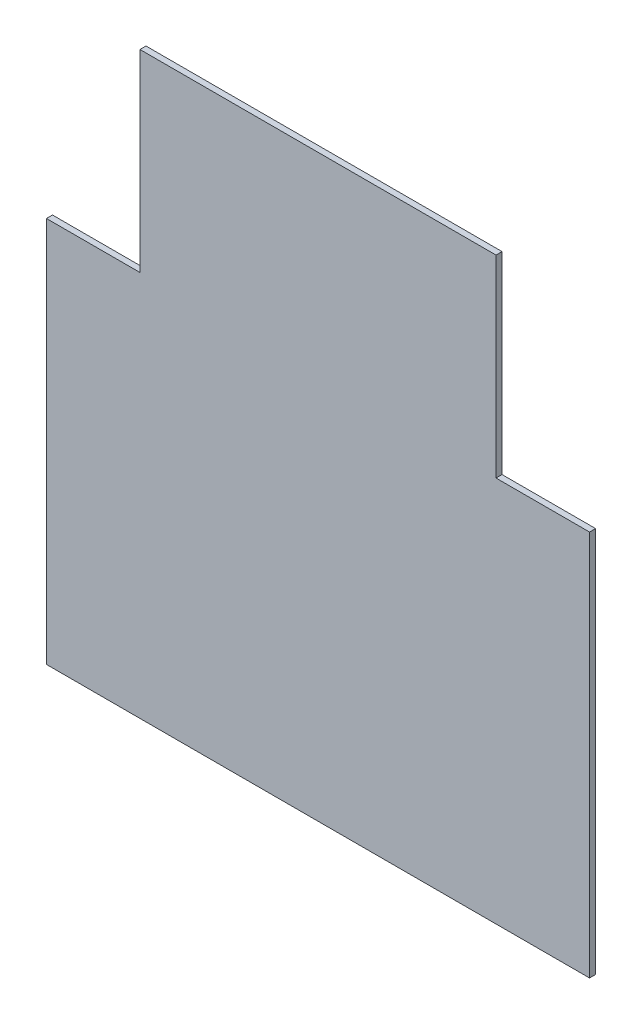
ISO-10303-21;
HEADER;
FILE_DESCRIPTION(('STEP AP214'),'2;1');
FILE_NAME('part.step','',(''),(''),'','','');
FILE_SCHEMA(('AUTOMOTIVE_DESIGN { 1 0 10303 214 1 1 1 1 }'));
ENDSEC;
DATA;
#1=APPLICATION_CONTEXT('core data for automotive mechanical design processes');
#2=APPLICATION_PROTOCOL_DEFINITION('international standard','automotive_design',2000,#1);
#3=PRODUCT_CONTEXT('',#1,'mechanical');
#4=PRODUCT('Part','Part','',(#3));
#5=PRODUCT_RELATED_PRODUCT_CATEGORY('part','',(#4));
#6=PRODUCT_DEFINITION_FORMATION('','',#4);
#7=PRODUCT_DEFINITION_CONTEXT('part definition',#1,'design');
#8=PRODUCT_DEFINITION('design','',#6,#7);
#9=PRODUCT_DEFINITION_SHAPE('','',#8);
#10=(LENGTH_UNIT() NAMED_UNIT(*) SI_UNIT(.MILLI.,.METRE.));
#11=(NAMED_UNIT(*) PLANE_ANGLE_UNIT() SI_UNIT($,.RADIAN.));
#12=(NAMED_UNIT(*) SI_UNIT($,.STERADIAN.) SOLID_ANGLE_UNIT());
#13=UNCERTAINTY_MEASURE_WITH_UNIT(LENGTH_MEASURE(1.E-05),#10,'distance_accuracy_value','');
#14=(GEOMETRIC_REPRESENTATION_CONTEXT(3) GLOBAL_UNCERTAINTY_ASSIGNED_CONTEXT((#13)) GLOBAL_UNIT_ASSIGNED_CONTEXT((#10,
#11,#12)) REPRESENTATION_CONTEXT('',''));
#15=CARTESIAN_POINT('',(0.,0.,0.));
#16=DIRECTION('',(0.,0.,1.));
#17=DIRECTION('',(1.,0.,0.));
#18=AXIS2_PLACEMENT_3D('',#15,#16,#17);
#19=CARTESIAN_POINT('',(142.875,101.6,3.175));
#20=DIRECTION('',(-1.,0.,0.));
#21=DIRECTION('',(0.,0.,1.));
#22=AXIS2_PLACEMENT_3D('',#19,#20,#21);
#23=PLANE('',#22);
#24=DIRECTION('',(0.,1.,0.));
#25=VECTOR('',#24,1.);
#26=CARTESIAN_POINT('',(142.875,101.6,0.));
#27=LINE('',#26,#25);
#28=CARTESIAN_POINT('',(142.875,-101.6,0.));
#29=VERTEX_POINT('',#28);
#30=CARTESIAN_POINT('',(142.875,101.6,0.));
#31=VERTEX_POINT('',#30);
#32=EDGE_CURVE('E144',#29,#31,#27,.T.);
#33=ORIENTED_EDGE('',*,*,#32,.T.);
#34=DIRECTION('',(0.,0.,-1.));
#35=VECTOR('',#34,1.);
#36=CARTESIAN_POINT('',(142.875,101.6,3.175));
#37=LINE('',#36,#35);
#38=CARTESIAN_POINT('',(142.875,101.6,3.175));
#39=VERTEX_POINT('',#38);
#40=EDGE_CURVE('E11',#39,#31,#37,.T.);
#41=ORIENTED_EDGE('',*,*,#40,.F.);
#42=DIRECTION('',(0.,1.,0.));
#43=VECTOR('',#42,1.);
#44=CARTESIAN_POINT('',(142.875,101.6,3.175));
#45=LINE('',#44,#43);
#46=CARTESIAN_POINT('',(142.875,-101.6,3.175));
#47=VERTEX_POINT('',#46);
#48=EDGE_CURVE('E166',#47,#39,#45,.T.);
#49=ORIENTED_EDGE('',*,*,#48,.F.);
#50=DIRECTION('',(0.,0.,-1.));
#51=VECTOR('',#50,1.);
#52=CARTESIAN_POINT('',(142.875,-101.6,3.175));
#53=LINE('',#52,#51);
#54=EDGE_CURVE('E140',#47,#29,#53,.T.);
#55=ORIENTED_EDGE('',*,*,#54,.T.);
#56=EDGE_LOOP('',(#33,#41,#49,#55));
#57=FACE_BOUND('',#56,.T.);
#58=ADVANCED_FACE('F43',(#57),#23,.F.);
#59=CARTESIAN_POINT('',(93.6625,101.6,3.175));
#60=DIRECTION('',(0.,-1.,0.));
#61=DIRECTION('',(0.,0.,-1.));
#62=AXIS2_PLACEMENT_3D('',#59,#60,#61);
#63=PLANE('',#62);
#64=DIRECTION('',(-1.,0.,0.));
#65=VECTOR('',#64,1.);
#66=CARTESIAN_POINT('',(93.6625,101.6,0.));
#67=LINE('',#66,#65);
#68=CARTESIAN_POINT('',(93.6625,101.6,0.));
#69=VERTEX_POINT('',#68);
#70=EDGE_CURVE('E148',#31,#69,#67,.T.);
#71=ORIENTED_EDGE('',*,*,#70,.T.);
#72=DIRECTION('',(0.,0.,-1.));
#73=VECTOR('',#72,1.);
#74=CARTESIAN_POINT('',(93.6625,101.6,3.175));
#75=LINE('',#74,#73);
#76=CARTESIAN_POINT('',(93.6625,101.6,3.175));
#77=VERTEX_POINT('',#76);
#78=EDGE_CURVE('E52',#77,#69,#75,.T.);
#79=ORIENTED_EDGE('',*,*,#78,.F.);
#80=DIRECTION('',(-1.,0.,0.));
#81=VECTOR('',#80,1.);
#82=CARTESIAN_POINT('',(93.6625,101.6,3.175));
#83=LINE('',#82,#81);
#84=EDGE_CURVE('E103',#39,#77,#83,.T.);
#85=ORIENTED_EDGE('',*,*,#84,.F.);
#86=ORIENTED_EDGE('',*,*,#40,.T.);
#87=EDGE_LOOP('',(#71,#79,#85,#86));
#88=FACE_BOUND('',#87,.T.);
#89=ADVANCED_FACE('F212',(#88),#63,.F.);
#90=CARTESIAN_POINT('',(93.6625,203.2,3.175));
#91=DIRECTION('',(-1.,0.,0.));
#92=DIRECTION('',(0.,-1.,0.));
#93=AXIS2_PLACEMENT_3D('',#90,#91,#92);
#94=PLANE('',#93);
#95=DIRECTION('',(0.,1.,0.));
#96=VECTOR('',#95,1.);
#97=CARTESIAN_POINT('',(93.6625,203.2,0.));
#98=LINE('',#97,#96);
#99=CARTESIAN_POINT('',(93.6625,203.2,0.));
#100=VERTEX_POINT('',#99);
#101=EDGE_CURVE('E151',#69,#100,#98,.T.);
#102=ORIENTED_EDGE('',*,*,#101,.T.);
#103=DIRECTION('',(0.,0.,-1.));
#104=VECTOR('',#103,1.);
#105=CARTESIAN_POINT('',(93.6625,203.2,3.175));
#106=LINE('',#105,#104);
#107=CARTESIAN_POINT('',(93.6625,203.2,3.175));
#108=VERTEX_POINT('',#107);
#109=EDGE_CURVE('E177',#108,#100,#106,.T.);
#110=ORIENTED_EDGE('',*,*,#109,.F.);
#111=DIRECTION('',(0.,1.,0.));
#112=VECTOR('',#111,1.);
#113=CARTESIAN_POINT('',(93.6625,203.2,3.175));
#114=LINE('',#113,#112);
#115=EDGE_CURVE('E187',#77,#108,#114,.T.);
#116=ORIENTED_EDGE('',*,*,#115,.F.);
#117=ORIENTED_EDGE('',*,*,#78,.T.);
#118=EDGE_LOOP('',(#102,#110,#116,#117));
#119=FACE_BOUND('',#118,.T.);
#120=ADVANCED_FACE('F185',(#119),#94,.F.);
#121=CARTESIAN_POINT('',(-93.6625,203.2,3.175));
#122=DIRECTION('',(0.,-1.,0.));
#123=DIRECTION('',(0.,0.,-1.));
#124=AXIS2_PLACEMENT_3D('',#121,#122,#123);
#125=PLANE('',#124);
#126=DIRECTION('',(-1.,0.,0.));
#127=VECTOR('',#126,1.);
#128=CARTESIAN_POINT('',(-93.6625,203.2,0.));
#129=LINE('',#128,#127);
#130=CARTESIAN_POINT('',(-93.6625,203.2,0.));
#131=VERTEX_POINT('',#130);
#132=EDGE_CURVE('E154',#100,#131,#129,.T.);
#133=ORIENTED_EDGE('',*,*,#132,.T.);
#134=DIRECTION('',(0.,0.,-1.));
#135=VECTOR('',#134,1.);
#136=CARTESIAN_POINT('',(-93.6625,203.2,3.175));
#137=LINE('',#136,#135);
#138=CARTESIAN_POINT('',(-93.6625,203.2,3.175));
#139=VERTEX_POINT('',#138);
#140=EDGE_CURVE('E173',#139,#131,#137,.T.);
#141=ORIENTED_EDGE('',*,*,#140,.F.);
#142=DIRECTION('',(-1.,0.,0.));
#143=VECTOR('',#142,1.);
#144=CARTESIAN_POINT('',(-93.6625,203.2,3.175));
#145=LINE('',#144,#143);
#146=EDGE_CURVE('E200',#108,#139,#145,.T.);
#147=ORIENTED_EDGE('',*,*,#146,.F.);
#148=ORIENTED_EDGE('',*,*,#109,.T.);
#149=EDGE_LOOP('',(#133,#141,#147,#148));
#150=FACE_BOUND('',#149,.T.);
#151=ADVANCED_FACE('F195',(#150),#125,.F.);
#152=CARTESIAN_POINT('',(-93.6625,203.2,3.175));
#153=DIRECTION('',(1.,0.,0.));
#154=DIRECTION('',(0.,0.,-1.));
#155=AXIS2_PLACEMENT_3D('',#152,#153,#154);
#156=PLANE('',#155);
#157=DIRECTION('',(0.,-1.,0.));
#158=VECTOR('',#157,1.);
#159=CARTESIAN_POINT('',(-93.6625,203.2,0.));
#160=LINE('',#159,#158);
#161=CARTESIAN_POINT('',(-93.6625,101.6,0.));
#162=VERTEX_POINT('',#161);
#163=EDGE_CURVE('E157',#131,#162,#160,.T.);
#164=ORIENTED_EDGE('',*,*,#163,.T.);
#165=DIRECTION('',(0.,0.,-1.));
#166=VECTOR('',#165,1.);
#167=CARTESIAN_POINT('',(-93.6625,101.6,3.175));
#168=LINE('',#167,#166);
#169=CARTESIAN_POINT('',(-93.6625,101.6,3.175));
#170=VERTEX_POINT('',#169);
#171=EDGE_CURVE('E133',#170,#162,#168,.T.);
#172=ORIENTED_EDGE('',*,*,#171,.F.);
#173=DIRECTION('',(0.,-1.,0.));
#174=VECTOR('',#173,1.);
#175=CARTESIAN_POINT('',(-93.6625,203.2,3.175));
#176=LINE('',#175,#174);
#177=EDGE_CURVE('E122',#139,#170,#176,.T.);
#178=ORIENTED_EDGE('',*,*,#177,.F.);
#179=ORIENTED_EDGE('',*,*,#140,.T.);
#180=EDGE_LOOP('',(#164,#172,#178,#179));
#181=FACE_BOUND('',#180,.T.);
#182=ADVANCED_FACE('F198',(#181),#156,.F.);
#183=CARTESIAN_POINT('',(-142.875,101.6,3.175));
#184=DIRECTION('',(0.,-1.,0.));
#185=DIRECTION('',(0.,0.,-1.));
#186=AXIS2_PLACEMENT_3D('',#183,#184,#185);
#187=PLANE('',#186);
#188=DIRECTION('',(-1.,0.,0.));
#189=VECTOR('',#188,1.);
#190=CARTESIAN_POINT('',(-142.875,101.6,0.));
#191=LINE('',#190,#189);
#192=CARTESIAN_POINT('',(-142.875,101.6,0.));
#193=VERTEX_POINT('',#192);
#194=EDGE_CURVE('E131',#162,#193,#191,.T.);
#195=ORIENTED_EDGE('',*,*,#194,.T.);
#196=DIRECTION('',(0.,0.,-1.));
#197=VECTOR('',#196,1.);
#198=CARTESIAN_POINT('',(-142.875,101.6,3.175));
#199=LINE('',#198,#197);
#200=CARTESIAN_POINT('',(-142.875,101.6,3.175));
#201=VERTEX_POINT('',#200);
#202=EDGE_CURVE('E128',#201,#193,#199,.T.);
#203=ORIENTED_EDGE('',*,*,#202,.F.);
#204=DIRECTION('',(-1.,0.,0.));
#205=VECTOR('',#204,1.);
#206=CARTESIAN_POINT('',(-142.875,101.6,3.175));
#207=LINE('',#206,#205);
#208=EDGE_CURVE('E116',#170,#201,#207,.T.);
#209=ORIENTED_EDGE('',*,*,#208,.F.);
#210=ORIENTED_EDGE('',*,*,#171,.T.);
#211=EDGE_LOOP('',(#195,#203,#209,#210));
#212=FACE_BOUND('',#211,.T.);
#213=ADVANCED_FACE('F129',(#212),#187,.F.);
#214=CARTESIAN_POINT('',(-142.875,101.6,3.175));
#215=DIRECTION('',(1.,0.,0.));
#216=DIRECTION('',(0.,1.,0.));
#217=AXIS2_PLACEMENT_3D('',#214,#215,#216);
#218=PLANE('',#217);
#219=DIRECTION('',(0.,-1.,0.));
#220=VECTOR('',#219,1.);
#221=CARTESIAN_POINT('',(-142.875,101.6,0.));
#222=LINE('',#221,#220);
#223=CARTESIAN_POINT('',(-142.875,-101.6,0.));
#224=VERTEX_POINT('',#223);
#225=EDGE_CURVE('E89',#193,#224,#222,.T.);
#226=ORIENTED_EDGE('',*,*,#225,.T.);
#227=DIRECTION('',(0.,0.,-1.));
#228=VECTOR('',#227,1.);
#229=CARTESIAN_POINT('',(-142.875,-101.6,3.175));
#230=LINE('',#229,#228);
#231=CARTESIAN_POINT('',(-142.875,-101.6,3.175));
#232=VERTEX_POINT('',#231);
#233=EDGE_CURVE('E134',#232,#224,#230,.T.);
#234=ORIENTED_EDGE('',*,*,#233,.F.);
#235=DIRECTION('',(0.,-1.,0.));
#236=VECTOR('',#235,1.);
#237=CARTESIAN_POINT('',(-142.875,101.6,3.175));
#238=LINE('',#237,#236);
#239=EDGE_CURVE('E120',#201,#232,#238,.T.);
#240=ORIENTED_EDGE('',*,*,#239,.F.);
#241=ORIENTED_EDGE('',*,*,#202,.T.);
#242=EDGE_LOOP('',(#226,#234,#240,#241));
#243=FACE_BOUND('',#242,.T.);
#244=ADVANCED_FACE('F136',(#243),#218,.F.);
#245=CARTESIAN_POINT('',(-142.875,-101.6,3.175));
#246=DIRECTION('',(0.,1.,0.));
#247=DIRECTION('',(0.,0.,1.));
#248=AXIS2_PLACEMENT_3D('',#245,#246,#247);
#249=PLANE('',#248);
#250=DIRECTION('',(1.,0.,0.));
#251=VECTOR('',#250,1.);
#252=CARTESIAN_POINT('',(-142.875,-101.6,0.));
#253=LINE('',#252,#251);
#254=EDGE_CURVE('E95',#224,#29,#253,.T.);
#255=ORIENTED_EDGE('',*,*,#254,.T.);
#256=ORIENTED_EDGE('',*,*,#54,.F.);
#257=DIRECTION('',(1.,0.,0.));
#258=VECTOR('',#257,1.);
#259=CARTESIAN_POINT('',(-142.875,-101.6,3.175));
#260=LINE('',#259,#258);
#261=EDGE_CURVE('E60',#232,#47,#260,.T.);
#262=ORIENTED_EDGE('',*,*,#261,.F.);
#263=ORIENTED_EDGE('',*,*,#233,.T.);
#264=EDGE_LOOP('',(#255,#256,#262,#263));
#265=FACE_BOUND('',#264,.T.);
#266=ADVANCED_FACE('F228',(#265),#249,.F.);
#267=CARTESIAN_POINT('',(0.,0.,3.175));
#268=DIRECTION('',(0.,0.,1.));
#269=DIRECTION('',(1.,0.,0.));
#270=AXIS2_PLACEMENT_3D('',#267,#268,#269);
#271=PLANE('',#270);
#272=ORIENTED_EDGE('',*,*,#48,.T.);
#273=ORIENTED_EDGE('',*,*,#84,.T.);
#274=ORIENTED_EDGE('',*,*,#115,.T.);
#275=ORIENTED_EDGE('',*,*,#146,.T.);
#276=ORIENTED_EDGE('',*,*,#177,.T.);
#277=ORIENTED_EDGE('',*,*,#208,.T.);
#278=ORIENTED_EDGE('',*,*,#239,.T.);
#279=ORIENTED_EDGE('',*,*,#261,.T.);
#280=EDGE_LOOP('',(#272,#273,#274,#275,#276,#277,#278,#279));
#281=FACE_BOUND('',#280,.T.);
#282=ADVANCED_FACE('F118',(#281),#271,.T.);
#283=CARTESIAN_POINT('',(0.,0.,0.));
#284=DIRECTION('',(0.,0.,1.));
#285=DIRECTION('',(1.,0.,0.));
#286=AXIS2_PLACEMENT_3D('',#283,#284,#285);
#287=PLANE('',#286);
#288=ORIENTED_EDGE('',*,*,#32,.F.);
#289=ORIENTED_EDGE('',*,*,#254,.F.);
#290=ORIENTED_EDGE('',*,*,#225,.F.);
#291=ORIENTED_EDGE('',*,*,#194,.F.);
#292=ORIENTED_EDGE('',*,*,#163,.F.);
#293=ORIENTED_EDGE('',*,*,#132,.F.);
#294=ORIENTED_EDGE('',*,*,#101,.F.);
#295=ORIENTED_EDGE('',*,*,#70,.F.);
#296=EDGE_LOOP('',(#288,#289,#290,#291,#292,#293,#294,#295));
#297=FACE_BOUND('',#296,.T.);
#298=ADVANCED_FACE('F191',(#297),#287,.F.);
#299=CLOSED_SHELL('',(#58,#89,#120,#151,#182,#213,#244,#266,#282,#298));
#300=MANIFOLD_SOLID_BREP('B2',#299);
#301=ADVANCED_BREP_SHAPE_REPRESENTATION('',(#18,#300),#14);
#302=SHAPE_DEFINITION_REPRESENTATION(#9,#301);
ENDSEC;
END-ISO-10303-21;
